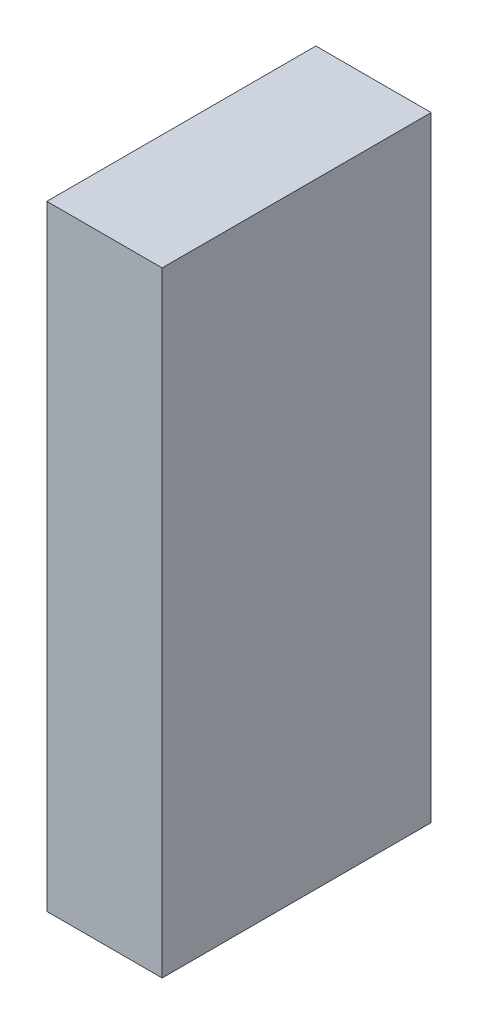
ISO-10303-21;
HEADER;
FILE_DESCRIPTION(('STEP AP214'),'2;1');
FILE_NAME('part.step','',(''),(''),'','','');
FILE_SCHEMA(('AUTOMOTIVE_DESIGN { 1 0 10303 214 1 1 1 1 }'));
ENDSEC;
DATA;
#1=APPLICATION_CONTEXT('core data for automotive mechanical design processes');
#2=APPLICATION_PROTOCOL_DEFINITION('international standard','automotive_design',2000,#1);
#3=PRODUCT_CONTEXT('',#1,'mechanical');
#4=PRODUCT('Part','Part','',(#3));
#5=PRODUCT_RELATED_PRODUCT_CATEGORY('part','',(#4));
#6=PRODUCT_DEFINITION_FORMATION('','',#4);
#7=PRODUCT_DEFINITION_CONTEXT('part definition',#1,'design');
#8=PRODUCT_DEFINITION('design','',#6,#7);
#9=PRODUCT_DEFINITION_SHAPE('','',#8);
#10=(LENGTH_UNIT() NAMED_UNIT(*) SI_UNIT(.MILLI.,.METRE.));
#11=(NAMED_UNIT(*) PLANE_ANGLE_UNIT() SI_UNIT($,.RADIAN.));
#12=(NAMED_UNIT(*) SI_UNIT($,.STERADIAN.) SOLID_ANGLE_UNIT());
#13=UNCERTAINTY_MEASURE_WITH_UNIT(LENGTH_MEASURE(1.E-05),#10,'distance_accuracy_value','');
#14=(GEOMETRIC_REPRESENTATION_CONTEXT(3) GLOBAL_UNCERTAINTY_ASSIGNED_CONTEXT((#13)) GLOBAL_UNIT_ASSIGNED_CONTEXT((#10,
#11,#12)) REPRESENTATION_CONTEXT('',''));
#15=CARTESIAN_POINT('',(0.,0.,0.));
#16=DIRECTION('',(0.,0.,1.));
#17=DIRECTION('',(1.,0.,0.));
#18=AXIS2_PLACEMENT_3D('',#15,#16,#17);
#19=CARTESIAN_POINT('',(0.,203.2,0.));
#20=DIRECTION('',(1.,0.,0.));
#21=DIRECTION('',(0.,0.,-1.));
#22=AXIS2_PLACEMENT_3D('',#19,#20,#21);
#23=PLANE('',#22);
#24=DIRECTION('',(0.,0.,1.));
#25=VECTOR('',#24,1.);
#26=CARTESIAN_POINT('',(0.,0.,0.));
#27=LINE('',#26,#25);
#28=CARTESIAN_POINT('',(0.,0.,-88.9));
#29=VERTEX_POINT('',#28);
#30=CARTESIAN_POINT('',(0.,0.,0.));
#31=VERTEX_POINT('',#30);
#32=EDGE_CURVE('E96',#29,#31,#27,.T.);
#33=ORIENTED_EDGE('',*,*,#32,.T.);
#34=DIRECTION('',(0.,-1.,0.));
#35=VECTOR('',#34,1.);
#36=CARTESIAN_POINT('',(0.,203.2,0.));
#37=LINE('',#36,#35);
#38=CARTESIAN_POINT('',(0.,203.2,0.));
#39=VERTEX_POINT('',#38);
#40=EDGE_CURVE('E11',#39,#31,#37,.T.);
#41=ORIENTED_EDGE('',*,*,#40,.F.);
#42=DIRECTION('',(0.,0.,1.));
#43=VECTOR('',#42,1.);
#44=CARTESIAN_POINT('',(0.,203.2,0.));
#45=LINE('',#44,#43);
#46=CARTESIAN_POINT('',(0.,203.2,-88.9));
#47=VERTEX_POINT('',#46);
#48=EDGE_CURVE('E84',#47,#39,#45,.T.);
#49=ORIENTED_EDGE('',*,*,#48,.F.);
#50=DIRECTION('',(0.,-1.,0.));
#51=VECTOR('',#50,1.);
#52=CARTESIAN_POINT('',(0.,203.2,-88.9));
#53=LINE('',#52,#51);
#54=EDGE_CURVE('E92',#47,#29,#53,.T.);
#55=ORIENTED_EDGE('',*,*,#54,.T.);
#56=EDGE_LOOP('',(#33,#41,#49,#55));
#57=FACE_BOUND('',#56,.T.);
#58=ADVANCED_FACE('F33',(#57),#23,.F.);
#59=CARTESIAN_POINT('',(0.,203.2,0.));
#60=DIRECTION('',(0.,0.,-1.));
#61=DIRECTION('',(-1.,0.,0.));
#62=AXIS2_PLACEMENT_3D('',#59,#60,#61);
#63=PLANE('',#62);
#64=DIRECTION('',(1.,0.,0.));
#65=VECTOR('',#64,1.);
#66=CARTESIAN_POINT('',(0.,0.,0.));
#67=LINE('',#66,#65);
#68=CARTESIAN_POINT('',(38.1,0.,0.));
#69=VERTEX_POINT('',#68);
#70=EDGE_CURVE('E88',#31,#69,#67,.T.);
#71=ORIENTED_EDGE('',*,*,#70,.T.);
#72=DIRECTION('',(0.,-1.,0.));
#73=VECTOR('',#72,1.);
#74=CARTESIAN_POINT('',(38.1,203.2,0.));
#75=LINE('',#74,#73);
#76=CARTESIAN_POINT('',(38.1,203.2,0.));
#77=VERTEX_POINT('',#76);
#78=EDGE_CURVE('E41',#77,#69,#75,.T.);
#79=ORIENTED_EDGE('',*,*,#78,.F.);
#80=DIRECTION('',(1.,0.,0.));
#81=VECTOR('',#80,1.);
#82=CARTESIAN_POINT('',(0.,203.2,0.));
#83=LINE('',#82,#81);
#84=EDGE_CURVE('E79',#39,#77,#83,.T.);
#85=ORIENTED_EDGE('',*,*,#84,.F.);
#86=ORIENTED_EDGE('',*,*,#40,.T.);
#87=EDGE_LOOP('',(#71,#79,#85,#86));
#88=FACE_BOUND('',#87,.T.);
#89=ADVANCED_FACE('F87',(#88),#63,.F.);
#90=CARTESIAN_POINT('',(38.1,203.2,0.));
#91=DIRECTION('',(-1.,0.,0.));
#92=DIRECTION('',(0.,0.,1.));
#93=AXIS2_PLACEMENT_3D('',#90,#91,#92);
#94=PLANE('',#93);
#95=DIRECTION('',(0.,0.,-1.));
#96=VECTOR('',#95,1.);
#97=CARTESIAN_POINT('',(38.1,0.,0.));
#98=LINE('',#97,#96);
#99=CARTESIAN_POINT('',(38.1,0.,-88.9));
#100=VERTEX_POINT('',#99);
#101=EDGE_CURVE('E66',#69,#100,#98,.T.);
#102=ORIENTED_EDGE('',*,*,#101,.T.);
#103=DIRECTION('',(0.,-1.,0.));
#104=VECTOR('',#103,1.);
#105=CARTESIAN_POINT('',(38.1,203.2,-88.9));
#106=LINE('',#105,#104);
#107=CARTESIAN_POINT('',(38.1,203.2,-88.9));
#108=VERTEX_POINT('',#107);
#109=EDGE_CURVE('E89',#108,#100,#106,.T.);
#110=ORIENTED_EDGE('',*,*,#109,.F.);
#111=DIRECTION('',(0.,0.,-1.));
#112=VECTOR('',#111,1.);
#113=CARTESIAN_POINT('',(38.1,203.2,0.));
#114=LINE('',#113,#112);
#115=EDGE_CURVE('E82',#77,#108,#114,.T.);
#116=ORIENTED_EDGE('',*,*,#115,.F.);
#117=ORIENTED_EDGE('',*,*,#78,.T.);
#118=EDGE_LOOP('',(#102,#110,#116,#117));
#119=FACE_BOUND('',#118,.T.);
#120=ADVANCED_FACE('F90',(#119),#94,.F.);
#121=CARTESIAN_POINT('',(0.,203.2,-88.9));
#122=DIRECTION('',(0.,0.,1.));
#123=DIRECTION('',(1.,0.,0.));
#124=AXIS2_PLACEMENT_3D('',#121,#122,#123);
#125=PLANE('',#124);
#126=DIRECTION('',(-1.,0.,0.));
#127=VECTOR('',#126,1.);
#128=CARTESIAN_POINT('',(0.,0.,-88.9));
#129=LINE('',#128,#127);
#130=EDGE_CURVE('E72',#100,#29,#129,.T.);
#131=ORIENTED_EDGE('',*,*,#130,.T.);
#132=ORIENTED_EDGE('',*,*,#54,.F.);
#133=DIRECTION('',(-1.,0.,0.));
#134=VECTOR('',#133,1.);
#135=CARTESIAN_POINT('',(0.,203.2,-88.9));
#136=LINE('',#135,#134);
#137=EDGE_CURVE('E49',#108,#47,#136,.T.);
#138=ORIENTED_EDGE('',*,*,#137,.F.);
#139=ORIENTED_EDGE('',*,*,#109,.T.);
#140=EDGE_LOOP('',(#131,#132,#138,#139));
#141=FACE_BOUND('',#140,.T.);
#142=ADVANCED_FACE('F103',(#141),#125,.F.);
#143=CARTESIAN_POINT('',(0.,203.2,0.));
#144=DIRECTION('',(0.,-1.,0.));
#145=DIRECTION('',(0.,0.,-1.));
#146=AXIS2_PLACEMENT_3D('',#143,#144,#145);
#147=PLANE('',#146);
#148=ORIENTED_EDGE('',*,*,#48,.T.);
#149=ORIENTED_EDGE('',*,*,#84,.T.);
#150=ORIENTED_EDGE('',*,*,#115,.T.);
#151=ORIENTED_EDGE('',*,*,#137,.T.);
#152=EDGE_LOOP('',(#148,#149,#150,#151));
#153=FACE_BOUND('',#152,.T.);
#154=ADVANCED_FACE('F80',(#153),#147,.F.);
#155=CARTESIAN_POINT('',(0.,0.,0.));
#156=DIRECTION('',(0.,-1.,0.));
#157=DIRECTION('',(0.,0.,-1.));
#158=AXIS2_PLACEMENT_3D('',#155,#156,#157);
#159=PLANE('',#158);
#160=ORIENTED_EDGE('',*,*,#32,.F.);
#161=ORIENTED_EDGE('',*,*,#130,.F.);
#162=ORIENTED_EDGE('',*,*,#101,.F.);
#163=ORIENTED_EDGE('',*,*,#70,.F.);
#164=EDGE_LOOP('',(#160,#161,#162,#163));
#165=FACE_BOUND('',#164,.T.);
#166=ADVANCED_FACE('F106',(#165),#159,.T.);
#167=CLOSED_SHELL('',(#58,#89,#120,#142,#154,#166));
#168=MANIFOLD_SOLID_BREP('B2',#167);
#169=ADVANCED_BREP_SHAPE_REPRESENTATION('',(#18,#168),#14);
#170=SHAPE_DEFINITION_REPRESENTATION(#9,#169);
ENDSEC;
END-ISO-10303-21;
